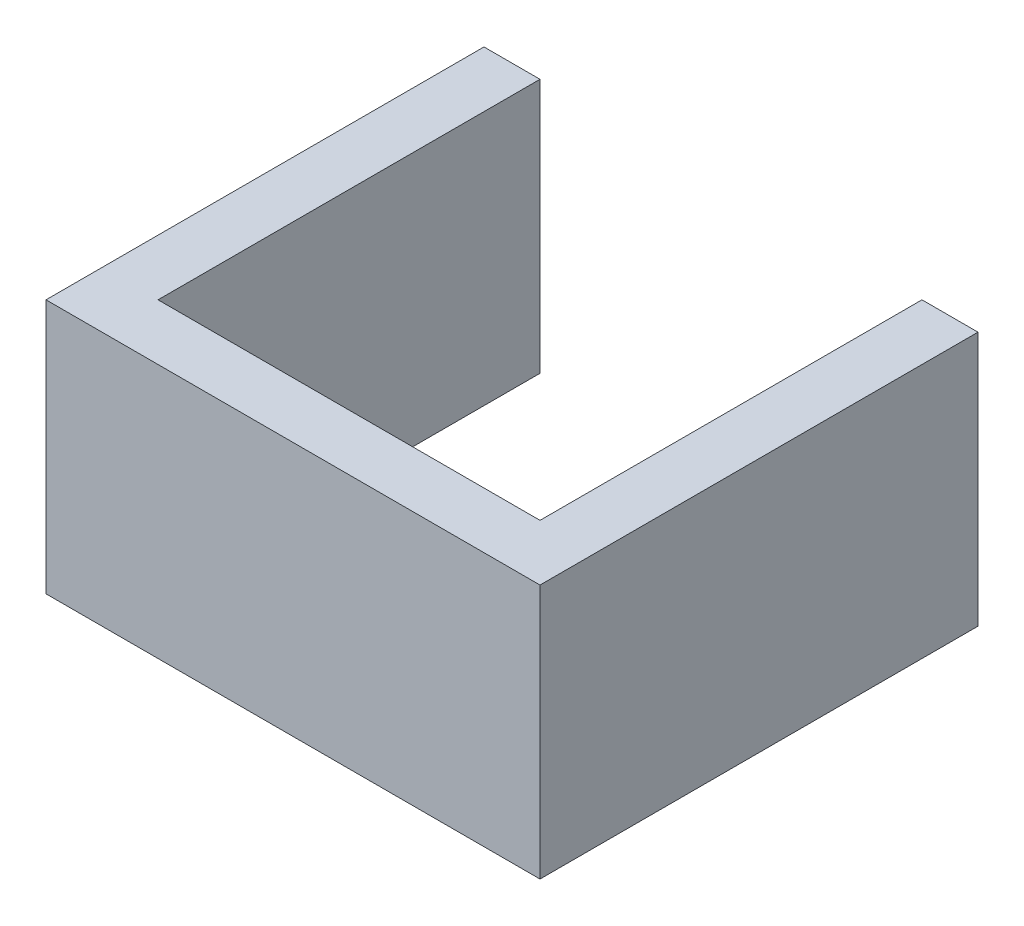
ISO-10303-21;
HEADER;
FILE_DESCRIPTION(('STEP AP214'),'2;1');
FILE_NAME('part.step','',(''),(''),'','','');
FILE_SCHEMA(('AUTOMOTIVE_DESIGN { 1 0 10303 214 1 1 1 1 }'));
ENDSEC;
DATA;
#1=APPLICATION_CONTEXT('core data for automotive mechanical design processes');
#2=APPLICATION_PROTOCOL_DEFINITION('international standard','automotive_design',2000,#1);
#3=PRODUCT_CONTEXT('',#1,'mechanical');
#4=PRODUCT('Part','Part','',(#3));
#5=PRODUCT_RELATED_PRODUCT_CATEGORY('part','',(#4));
#6=PRODUCT_DEFINITION_FORMATION('','',#4);
#7=PRODUCT_DEFINITION_CONTEXT('part definition',#1,'design');
#8=PRODUCT_DEFINITION('design','',#6,#7);
#9=PRODUCT_DEFINITION_SHAPE('','',#8);
#10=(LENGTH_UNIT() NAMED_UNIT(*) SI_UNIT(.MILLI.,.METRE.));
#11=(NAMED_UNIT(*) PLANE_ANGLE_UNIT() SI_UNIT($,.RADIAN.));
#12=(NAMED_UNIT(*) SI_UNIT($,.STERADIAN.) SOLID_ANGLE_UNIT());
#13=UNCERTAINTY_MEASURE_WITH_UNIT(LENGTH_MEASURE(1.E-05),#10,'distance_accuracy_value','');
#14=(GEOMETRIC_REPRESENTATION_CONTEXT(3) GLOBAL_UNCERTAINTY_ASSIGNED_CONTEXT((#13)) GLOBAL_UNIT_ASSIGNED_CONTEXT((#10,
#11,#12)) REPRESENTATION_CONTEXT('',''));
#15=CARTESIAN_POINT('',(0.,0.,0.));
#16=DIRECTION('',(0.,0.,1.));
#17=DIRECTION('',(1.,0.,0.));
#18=AXIS2_PLACEMENT_3D('',#15,#16,#17);
#19=CARTESIAN_POINT('',(172.,0.,0.));
#20=DIRECTION('',(0.,0.,-1.));
#21=DIRECTION('',(-1.,0.,0.));
#22=AXIS2_PLACEMENT_3D('',#19,#20,#21);
#23=PLANE('',#22);
#24=DIRECTION('',(1.,0.,0.));
#25=VECTOR('',#24,1.);
#26=CARTESIAN_POINT('',(75.,100.,0.));
#27=LINE('',#26,#25);
#28=CARTESIAN_POINT('',(172.,100.,0.));
#29=VERTEX_POINT('',#28);
#30=CARTESIAN_POINT('',(150.,100.,0.));
#31=VERTEX_POINT('',#30);
#32=EDGE_CURVE('E121',#29,#31,#27,.F.);
#33=ORIENTED_EDGE('',*,*,#32,.F.);
#34=DIRECTION('',(0.,1.,0.));
#35=VECTOR('',#34,1.);
#36=CARTESIAN_POINT('',(172.,0.,0.));
#37=LINE('',#36,#35);
#38=CARTESIAN_POINT('',(172.,0.,0.));
#39=VERTEX_POINT('',#38);
#40=EDGE_CURVE('E86',#39,#29,#37,.T.);
#41=ORIENTED_EDGE('',*,*,#40,.F.);
#42=DIRECTION('',(1.,0.,0.));
#43=VECTOR('',#42,1.);
#44=CARTESIAN_POINT('',(75.,0.,0.));
#45=LINE('',#44,#43);
#46=CARTESIAN_POINT('',(150.,0.,0.));
#47=VERTEX_POINT('',#46);
#48=EDGE_CURVE('E83',#39,#47,#45,.F.);
#49=ORIENTED_EDGE('',*,*,#48,.T.);
#50=DIRECTION('',(0.,1.,0.));
#51=VECTOR('',#50,1.);
#52=CARTESIAN_POINT('',(150.,0.,0.));
#53=LINE('',#52,#51);
#54=EDGE_CURVE('E19',#31,#47,#53,.F.);
#55=ORIENTED_EDGE('',*,*,#54,.F.);
#56=EDGE_LOOP('',(#33,#41,#49,#55));
#57=FACE_BOUND('',#56,.T.);
#58=ADVANCED_FACE('F16',(#57),#23,.T.);
#59=CARTESIAN_POINT('',(150.,0.,0.));
#60=DIRECTION('',(-1.,0.,0.));
#61=DIRECTION('',(0.,0.,1.));
#62=AXIS2_PLACEMENT_3D('',#59,#60,#61);
#63=PLANE('',#62);
#64=DIRECTION('',(0.,0.,1.));
#65=VECTOR('',#64,1.);
#66=CARTESIAN_POINT('',(150.,100.,86.));
#67=LINE('',#66,#65);
#68=CARTESIAN_POINT('',(150.,100.,150.));
#69=VERTEX_POINT('',#68);
#70=EDGE_CURVE('E93',#31,#69,#67,.T.);
#71=ORIENTED_EDGE('',*,*,#70,.F.);
#72=ORIENTED_EDGE('',*,*,#54,.T.);
#73=DIRECTION('',(0.,0.,1.));
#74=VECTOR('',#73,1.);
#75=CARTESIAN_POINT('',(150.,0.,86.));
#76=LINE('',#75,#74);
#77=CARTESIAN_POINT('',(150.,0.,150.));
#78=VERTEX_POINT('',#77);
#79=EDGE_CURVE('E78',#47,#78,#76,.T.);
#80=ORIENTED_EDGE('',*,*,#79,.T.);
#81=DIRECTION('',(0.,1.,0.));
#82=VECTOR('',#81,1.);
#83=CARTESIAN_POINT('',(150.,0.,150.));
#84=LINE('',#83,#82);
#85=EDGE_CURVE('E95',#69,#78,#84,.F.);
#86=ORIENTED_EDGE('',*,*,#85,.F.);
#87=EDGE_LOOP('',(#71,#72,#80,#86));
#88=FACE_BOUND('',#87,.T.);
#89=ADVANCED_FACE('F91',(#88),#63,.T.);
#90=CARTESIAN_POINT('',(150.,0.,150.));
#91=DIRECTION('',(0.,0.,-1.));
#92=DIRECTION('',(-1.,0.,0.));
#93=AXIS2_PLACEMENT_3D('',#90,#91,#92);
#94=PLANE('',#93);
#95=DIRECTION('',(1.,0.,0.));
#96=VECTOR('',#95,1.);
#97=CARTESIAN_POINT('',(75.,100.,150.));
#98=LINE('',#97,#96);
#99=CARTESIAN_POINT('',(0.,100.,150.));
#100=VERTEX_POINT('',#99);
#101=EDGE_CURVE('E114',#69,#100,#98,.F.);
#102=ORIENTED_EDGE('',*,*,#101,.F.);
#103=ORIENTED_EDGE('',*,*,#85,.T.);
#104=DIRECTION('',(1.,0.,0.));
#105=VECTOR('',#104,1.);
#106=CARTESIAN_POINT('',(75.,0.,150.));
#107=LINE('',#106,#105);
#108=CARTESIAN_POINT('',(0.,0.,150.));
#109=VERTEX_POINT('',#108);
#110=EDGE_CURVE('E100',#78,#109,#107,.F.);
#111=ORIENTED_EDGE('',*,*,#110,.T.);
#112=DIRECTION('',(0.,1.,0.));
#113=VECTOR('',#112,1.);
#114=CARTESIAN_POINT('',(0.,0.,150.));
#115=LINE('',#114,#113);
#116=EDGE_CURVE('E108',#100,#109,#115,.F.);
#117=ORIENTED_EDGE('',*,*,#116,.F.);
#118=EDGE_LOOP('',(#102,#103,#111,#117));
#119=FACE_BOUND('',#118,.T.);
#120=ADVANCED_FACE('F112',(#119),#94,.T.);
#121=CARTESIAN_POINT('',(0.,0.,150.));
#122=DIRECTION('',(1.,0.,0.));
#123=DIRECTION('',(0.,0.,-1.));
#124=AXIS2_PLACEMENT_3D('',#121,#122,#123);
#125=PLANE('',#124);
#126=DIRECTION('',(0.,0.,1.));
#127=VECTOR('',#126,1.);
#128=CARTESIAN_POINT('',(0.,100.,86.));
#129=LINE('',#128,#127);
#130=CARTESIAN_POINT('',(0.,100.,0.));
#131=VERTEX_POINT('',#130);
#132=EDGE_CURVE('E117',#100,#131,#129,.F.);
#133=ORIENTED_EDGE('',*,*,#132,.F.);
#134=ORIENTED_EDGE('',*,*,#116,.T.);
#135=DIRECTION('',(0.,0.,1.));
#136=VECTOR('',#135,1.);
#137=CARTESIAN_POINT('',(0.,0.,86.));
#138=LINE('',#137,#136);
#139=CARTESIAN_POINT('',(0.,0.,0.));
#140=VERTEX_POINT('',#139);
#141=EDGE_CURVE('E102',#109,#140,#138,.F.);
#142=ORIENTED_EDGE('',*,*,#141,.T.);
#143=DIRECTION('',(0.,1.,0.));
#144=VECTOR('',#143,1.);
#145=CARTESIAN_POINT('',(0.,0.,0.));
#146=LINE('',#145,#144);
#147=EDGE_CURVE('E89',#131,#140,#146,.F.);
#148=ORIENTED_EDGE('',*,*,#147,.F.);
#149=EDGE_LOOP('',(#133,#134,#142,#148));
#150=FACE_BOUND('',#149,.T.);
#151=ADVANCED_FACE('F133',(#150),#125,.T.);
#152=CARTESIAN_POINT('',(0.,0.,0.));
#153=DIRECTION('',(0.,0.,-1.));
#154=DIRECTION('',(-1.,0.,0.));
#155=AXIS2_PLACEMENT_3D('',#152,#153,#154);
#156=PLANE('',#155);
#157=DIRECTION('',(1.,0.,0.));
#158=VECTOR('',#157,1.);
#159=CARTESIAN_POINT('',(75.,100.,0.));
#160=LINE('',#159,#158);
#161=CARTESIAN_POINT('',(-22.,100.,0.));
#162=VERTEX_POINT('',#161);
#163=EDGE_CURVE('E139',#131,#162,#160,.F.);
#164=ORIENTED_EDGE('',*,*,#163,.F.);
#165=ORIENTED_EDGE('',*,*,#147,.T.);
#166=DIRECTION('',(1.,0.,0.));
#167=VECTOR('',#166,1.);
#168=CARTESIAN_POINT('',(75.,0.,0.));
#169=LINE('',#168,#167);
#170=CARTESIAN_POINT('',(-22.,0.,0.));
#171=VERTEX_POINT('',#170);
#172=EDGE_CURVE('E131',#140,#171,#169,.F.);
#173=ORIENTED_EDGE('',*,*,#172,.T.);
#174=DIRECTION('',(0.,1.,0.));
#175=VECTOR('',#174,1.);
#176=CARTESIAN_POINT('',(-22.,0.,0.));
#177=LINE('',#176,#175);
#178=EDGE_CURVE('E147',#162,#171,#177,.F.);
#179=ORIENTED_EDGE('',*,*,#178,.F.);
#180=EDGE_LOOP('',(#164,#165,#173,#179));
#181=FACE_BOUND('',#180,.T.);
#182=ADVANCED_FACE('F136',(#181),#156,.T.);
#183=CARTESIAN_POINT('',(75.,0.,86.));
#184=DIRECTION('',(0.,1.,0.));
#185=DIRECTION('',(0.,0.,1.));
#186=AXIS2_PLACEMENT_3D('',#183,#184,#185);
#187=PLANE('',#186);
#188=ORIENTED_EDGE('',*,*,#172,.F.);
#189=ORIENTED_EDGE('',*,*,#141,.F.);
#190=ORIENTED_EDGE('',*,*,#110,.F.);
#191=ORIENTED_EDGE('',*,*,#79,.F.);
#192=ORIENTED_EDGE('',*,*,#48,.F.);
#193=DIRECTION('',(0.,0.,-1.));
#194=VECTOR('',#193,1.);
#195=CARTESIAN_POINT('',(172.,0.,172.));
#196=LINE('',#195,#194);
#197=CARTESIAN_POINT('',(172.,0.,172.));
#198=VERTEX_POINT('',#197);
#199=EDGE_CURVE('E129',#198,#39,#196,.T.);
#200=ORIENTED_EDGE('',*,*,#199,.F.);
#201=DIRECTION('',(1.,0.,0.));
#202=VECTOR('',#201,1.);
#203=CARTESIAN_POINT('',(-22.,0.,172.));
#204=LINE('',#203,#202);
#205=CARTESIAN_POINT('',(-22.,0.,172.));
#206=VERTEX_POINT('',#205);
#207=EDGE_CURVE('E144',#206,#198,#204,.T.);
#208=ORIENTED_EDGE('',*,*,#207,.F.);
#209=DIRECTION('',(0.,0.,1.));
#210=VECTOR('',#209,1.);
#211=CARTESIAN_POINT('',(-22.,0.,0.));
#212=LINE('',#211,#210);
#213=EDGE_CURVE('E141',#171,#206,#212,.T.);
#214=ORIENTED_EDGE('',*,*,#213,.F.);
#215=EDGE_LOOP('',(#188,#189,#190,#191,#192,#200,#208,#214));
#216=FACE_BOUND('',#215,.T.);
#217=ADVANCED_FACE('F98',(#216),#187,.F.);
#218=CARTESIAN_POINT('',(172.,0.,172.));
#219=DIRECTION('',(1.,0.,0.));
#220=DIRECTION('',(0.,0.,-1.));
#221=AXIS2_PLACEMENT_3D('',#218,#219,#220);
#222=PLANE('',#221);
#223=DIRECTION('',(0.,0.,1.));
#224=VECTOR('',#223,1.);
#225=CARTESIAN_POINT('',(172.,100.,86.));
#226=LINE('',#225,#224);
#227=CARTESIAN_POINT('',(172.,100.,172.));
#228=VERTEX_POINT('',#227);
#229=EDGE_CURVE('E123',#228,#29,#226,.F.);
#230=ORIENTED_EDGE('',*,*,#229,.F.);
#231=DIRECTION('',(0.,1.,0.));
#232=VECTOR('',#231,1.);
#233=CARTESIAN_POINT('',(172.,0.,172.));
#234=LINE('',#233,#232);
#235=EDGE_CURVE('E150',#198,#228,#234,.T.);
#236=ORIENTED_EDGE('',*,*,#235,.F.);
#237=ORIENTED_EDGE('',*,*,#199,.T.);
#238=ORIENTED_EDGE('',*,*,#40,.T.);
#239=EDGE_LOOP('',(#230,#236,#237,#238));
#240=FACE_BOUND('',#239,.T.);
#241=ADVANCED_FACE('F162',(#240),#222,.T.);
#242=CARTESIAN_POINT('',(75.,100.,86.));
#243=DIRECTION('',(0.,1.,0.));
#244=DIRECTION('',(0.,0.,1.));
#245=AXIS2_PLACEMENT_3D('',#242,#243,#244);
#246=PLANE('',#245);
#247=ORIENTED_EDGE('',*,*,#132,.T.);
#248=ORIENTED_EDGE('',*,*,#163,.T.);
#249=DIRECTION('',(0.,0.,1.));
#250=VECTOR('',#249,1.);
#251=CARTESIAN_POINT('',(-22.,100.,0.));
#252=LINE('',#251,#250);
#253=CARTESIAN_POINT('',(-22.,100.,172.));
#254=VERTEX_POINT('',#253);
#255=EDGE_CURVE('E34',#254,#162,#252,.F.);
#256=ORIENTED_EDGE('',*,*,#255,.F.);
#257=DIRECTION('',(1.,0.,0.));
#258=VECTOR('',#257,1.);
#259=CARTESIAN_POINT('',(-22.,100.,172.));
#260=LINE('',#259,#258);
#261=EDGE_CURVE('E25',#228,#254,#260,.F.);
#262=ORIENTED_EDGE('',*,*,#261,.F.);
#263=ORIENTED_EDGE('',*,*,#229,.T.);
#264=ORIENTED_EDGE('',*,*,#32,.T.);
#265=ORIENTED_EDGE('',*,*,#70,.T.);
#266=ORIENTED_EDGE('',*,*,#101,.T.);
#267=EDGE_LOOP('',(#247,#248,#256,#262,#263,#264,#265,#266));
#268=FACE_BOUND('',#267,.T.);
#269=ADVANCED_FACE('F119',(#268),#246,.T.);
#270=CARTESIAN_POINT('',(-22.,0.,0.));
#271=DIRECTION('',(-1.,0.,0.));
#272=DIRECTION('',(0.,0.,1.));
#273=AXIS2_PLACEMENT_3D('',#270,#271,#272);
#274=PLANE('',#273);
#275=ORIENTED_EDGE('',*,*,#255,.T.);
#276=ORIENTED_EDGE('',*,*,#178,.T.);
#277=ORIENTED_EDGE('',*,*,#213,.T.);
#278=DIRECTION('',(0.,1.,0.));
#279=VECTOR('',#278,1.);
#280=CARTESIAN_POINT('',(-22.,0.,172.));
#281=LINE('',#280,#279);
#282=EDGE_CURVE('E11',#254,#206,#281,.F.);
#283=ORIENTED_EDGE('',*,*,#282,.F.);
#284=EDGE_LOOP('',(#275,#276,#277,#283));
#285=FACE_BOUND('',#284,.T.);
#286=ADVANCED_FACE('F148',(#285),#274,.T.);
#287=CARTESIAN_POINT('',(-22.,0.,172.));
#288=DIRECTION('',(0.,0.,1.));
#289=DIRECTION('',(1.,0.,0.));
#290=AXIS2_PLACEMENT_3D('',#287,#288,#289);
#291=PLANE('',#290);
#292=ORIENTED_EDGE('',*,*,#261,.T.);
#293=ORIENTED_EDGE('',*,*,#282,.T.);
#294=ORIENTED_EDGE('',*,*,#207,.T.);
#295=ORIENTED_EDGE('',*,*,#235,.T.);
#296=EDGE_LOOP('',(#292,#293,#294,#295));
#297=FACE_BOUND('',#296,.T.);
#298=ADVANCED_FACE('F159',(#297),#291,.T.);
#299=CLOSED_SHELL('',(#58,#89,#120,#151,#182,#217,#241,#269,#286,#298));
#300=MANIFOLD_SOLID_BREP('B1',#299);
#301=ADVANCED_BREP_SHAPE_REPRESENTATION('',(#18,#300),#14);
#302=SHAPE_DEFINITION_REPRESENTATION(#9,#301);
ENDSEC;
END-ISO-10303-21;
